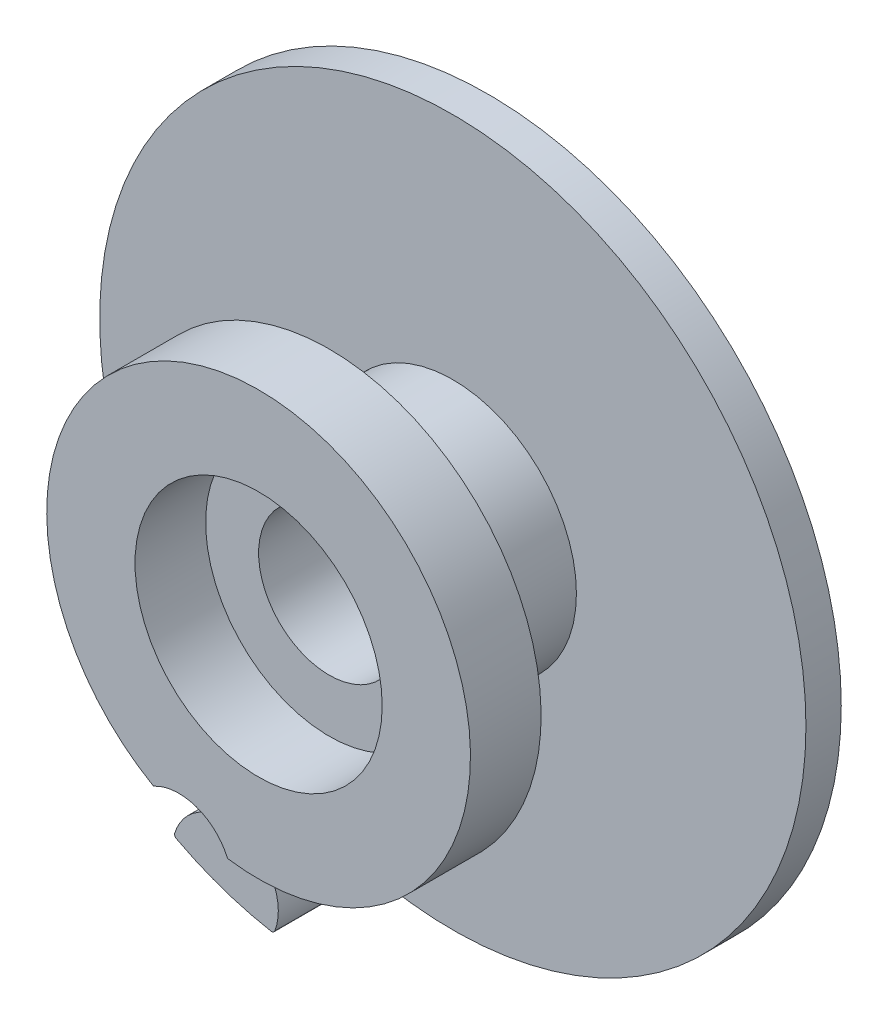
ISO-10303-21;
HEADER;
FILE_DESCRIPTION(('STEP AP214'),'2;1');
FILE_NAME('part.step','',(''),(''),'','','');
FILE_SCHEMA(('AUTOMOTIVE_DESIGN { 1 0 10303 214 1 1 1 1 }'));
ENDSEC;
DATA;
#1=APPLICATION_CONTEXT('core data for automotive mechanical design processes');
#2=APPLICATION_PROTOCOL_DEFINITION('international standard','automotive_design',2000,#1);
#3=PRODUCT_CONTEXT('',#1,'mechanical');
#4=PRODUCT('Part','Part','',(#3));
#5=PRODUCT_RELATED_PRODUCT_CATEGORY('part','',(#4));
#6=PRODUCT_DEFINITION_FORMATION('','',#4);
#7=PRODUCT_DEFINITION_CONTEXT('part definition',#1,'design');
#8=PRODUCT_DEFINITION('design','',#6,#7);
#9=PRODUCT_DEFINITION_SHAPE('','',#8);
#10=(LENGTH_UNIT() NAMED_UNIT(*) SI_UNIT(.MILLI.,.METRE.));
#11=(NAMED_UNIT(*) PLANE_ANGLE_UNIT() SI_UNIT($,.RADIAN.));
#12=(NAMED_UNIT(*) SI_UNIT($,.STERADIAN.) SOLID_ANGLE_UNIT());
#13=UNCERTAINTY_MEASURE_WITH_UNIT(LENGTH_MEASURE(1.E-05),#10,'distance_accuracy_value','');
#14=(GEOMETRIC_REPRESENTATION_CONTEXT(3) GLOBAL_UNCERTAINTY_ASSIGNED_CONTEXT((#13)) GLOBAL_UNIT_ASSIGNED_CONTEXT((#10,
#11,#12)) REPRESENTATION_CONTEXT('',''));
#15=CARTESIAN_POINT('',(0.,0.,0.));
#16=DIRECTION('',(0.,0.,1.));
#17=DIRECTION('',(1.,0.,0.));
#18=AXIS2_PLACEMENT_3D('',#15,#16,#17);
#19=CARTESIAN_POINT('',(-0.45148201026022,11.828968161543,1.3));
#20=DIRECTION('',(0.,0.,-1.));
#21=DIRECTION('',(-1.,0.,0.));
#22=AXIS2_PLACEMENT_3D('',#19,#20,#21);
#23=CYLINDRICAL_SURFACE('',#22,0.3);
#24=CARTESIAN_POINT('',(-0.45148201026022,11.828968161543,0.9));
#25=DIRECTION('',(0.,0.,1.));
#26=DIRECTION('',(1.,0.,0.));
#27=AXIS2_PLACEMENT_3D('',#24,#25,#26);
#28=CIRCLE('',#27,0.3);
#29=CARTESIAN_POINT('',(-0.175768873149546,11.9472147937343,0.9));
#30=VERTEX_POINT('',#29);
#31=CARTESIAN_POINT('',(-0.595215784732207,12.092294199139,0.9));
#32=VERTEX_POINT('',#31);
#33=EDGE_CURVE('E74',#30,#32,#28,.T.);
#34=ORIENTED_EDGE('',*,*,#33,.F.);
#35=DIRECTION('',(0.,0.,-1.));
#36=VECTOR('',#35,1.);
#37=CARTESIAN_POINT('',(-0.175768873149546,11.9472147937343,1.3));
#38=LINE('',#37,#36);
#39=CARTESIAN_POINT('',(-0.175768873149546,11.9472147937343,1.3));
#40=VERTEX_POINT('',#39);
#41=EDGE_CURVE('E12',#40,#30,#38,.T.);
#42=ORIENTED_EDGE('',*,*,#41,.F.);
#43=CARTESIAN_POINT('',(-0.45148201026022,11.828968161543,1.3));
#44=DIRECTION('',(0.,0.,1.));
#45=DIRECTION('',(1.,0.,0.));
#46=AXIS2_PLACEMENT_3D('',#43,#44,#45);
#47=CIRCLE('',#46,0.3);
#48=CARTESIAN_POINT('',(-0.595215784732207,12.092294199139,1.3));
#49=VERTEX_POINT('',#48);
#50=EDGE_CURVE('E75',#40,#49,#47,.T.);
#51=ORIENTED_EDGE('',*,*,#50,.T.);
#52=DIRECTION('',(0.,0.,-1.));
#53=VECTOR('',#52,1.);
#54=CARTESIAN_POINT('',(-0.595215784732207,12.092294199139,1.3));
#55=LINE('',#54,#53);
#56=EDGE_CURVE('E54',#49,#32,#55,.T.);
#57=ORIENTED_EDGE('',*,*,#56,.T.);
#58=EDGE_LOOP('',(#34,#42,#51,#57));
#59=FACE_BOUND('',#58,.T.);
#60=ADVANCED_FACE('F46',(#59),#23,.F.);
#61=CARTESIAN_POINT('',(0.,13.1342722073549,1.3));
#62=DIRECTION('',(0.,0.,-1.));
#63=DIRECTION('',(-1.,0.,0.));
#64=AXIS2_PLACEMENT_3D('',#61,#62,#63);
#65=CYLINDRICAL_SURFACE('',#64,1.2);
#66=CARTESIAN_POINT('',(0.,13.1342722073549,0.9));
#67=DIRECTION('',(0.,0.,1.));
#68=DIRECTION('',(1.,0.,0.));
#69=AXIS2_PLACEMENT_3D('',#66,#67,#68);
#70=CIRCLE('',#69,1.2);
#71=EDGE_CURVE('E77',#30,#32,#70,.T.);
#72=ORIENTED_EDGE('',*,*,#71,.T.);
#73=ORIENTED_EDGE('',*,*,#56,.F.);
#74=CARTESIAN_POINT('',(0.,13.1342722073549,1.3));
#75=DIRECTION('',(0.,0.,1.));
#76=DIRECTION('',(1.,0.,0.));
#77=AXIS2_PLACEMENT_3D('',#74,#75,#76);
#78=CIRCLE('',#77,1.2);
#79=EDGE_CURVE('E61',#40,#49,#78,.T.);
#80=ORIENTED_EDGE('',*,*,#79,.F.);
#81=ORIENTED_EDGE('',*,*,#41,.T.);
#82=EDGE_LOOP('',(#72,#73,#80,#81));
#83=FACE_BOUND('',#82,.T.);
#84=ADVANCED_FACE('F78',(#83),#65,.T.);
#85=CARTESIAN_POINT('',(0.,13.1342722073549,1.3));
#86=DIRECTION('',(0.,0.,-1.));
#87=DIRECTION('',(-1.,0.,0.));
#88=AXIS2_PLACEMENT_3D('',#85,#86,#87);
#89=CYLINDRICAL_SURFACE('',#88,0.7);
#90=CARTESIAN_POINT('',(0.,13.1342722073549,1.3));
#91=DIRECTION('',(0.,0.,1.));
#92=DIRECTION('',(1.,0.,0.));
#93=AXIS2_PLACEMENT_3D('',#90,#91,#92);
#94=CIRCLE('',#93,0.7);
#95=CARTESIAN_POINT('',(0.7,13.1342722073549,1.3));
#96=VERTEX_POINT('',#95);
#97=EDGE_CURVE('E76',#96,#96,#94,.T.);
#98=ORIENTED_EDGE('',*,*,#97,.T.);
#99=EDGE_LOOP('',(#98));
#100=FACE_BOUND('',#99,.T.);
#101=CARTESIAN_POINT('',(0.,13.1342722073549,0.9));
#102=DIRECTION('',(0.,0.,1.));
#103=DIRECTION('',(1.,0.,0.));
#104=AXIS2_PLACEMENT_3D('',#101,#102,#103);
#105=CIRCLE('',#104,0.7);
#106=CARTESIAN_POINT('',(0.7,13.1342722073549,0.9));
#107=VERTEX_POINT('',#106);
#108=EDGE_CURVE('E80',#107,#107,#105,.T.);
#109=ORIENTED_EDGE('',*,*,#108,.F.);
#110=EDGE_LOOP('',(#109));
#111=FACE_BOUND('',#110,.T.);
#112=ADVANCED_FACE('F94',(#100,#111),#89,.F.);
#113=CARTESIAN_POINT('',(0.,0.,1.3));
#114=DIRECTION('',(0.,0.,1.));
#115=DIRECTION('',(1.,0.,0.));
#116=AXIS2_PLACEMENT_3D('',#113,#114,#115);
#117=PLANE('',#116);
#118=ORIENTED_EDGE('',*,*,#50,.F.);
#119=ORIENTED_EDGE('',*,*,#79,.T.);
#120=EDGE_LOOP('',(#118,#119));
#121=FACE_BOUND('',#120,.T.);
#122=ORIENTED_EDGE('',*,*,#97,.F.);
#123=EDGE_LOOP('',(#122));
#124=FACE_BOUND('',#123,.T.);
#125=ADVANCED_FACE('F97',(#121,#124),#117,.T.);
#126=CARTESIAN_POINT('',(0.,0.,0.9));
#127=DIRECTION('',(0.,0.,1.));
#128=DIRECTION('',(1.,0.,0.));
#129=AXIS2_PLACEMENT_3D('',#126,#127,#128);
#130=PLANE('',#129);
#131=ORIENTED_EDGE('',*,*,#33,.T.);
#132=ORIENTED_EDGE('',*,*,#71,.F.);
#133=EDGE_LOOP('',(#131,#132));
#134=FACE_BOUND('',#133,.T.);
#135=ORIENTED_EDGE('',*,*,#108,.T.);
#136=EDGE_LOOP('',(#135));
#137=FACE_BOUND('',#136,.T.);
#138=ADVANCED_FACE('F82',(#134,#137),#130,.F.);
#139=CLOSED_SHELL('',(#60,#84,#112,#125,#138));
#140=MANIFOLD_SOLID_BREP('B2',#139);
#141=CARTESIAN_POINT('',(0.,0.,0.2));
#142=DIRECTION('',(0.,0.,1.));
#143=DIRECTION('',(1.,0.,0.));
#144=AXIS2_PLACEMENT_3D('',#141,#142,#143);
#145=PLANE('',#144);
#146=CARTESIAN_POINT('',(0.,13.1342722073549,0.2));
#147=DIRECTION('',(0.,0.,1.));
#148=DIRECTION('',(1.,0.,0.));
#149=AXIS2_PLACEMENT_3D('',#146,#147,#148);
#150=CIRCLE('',#149,0.7);
#151=CARTESIAN_POINT('',(0.7,13.1342722073549,0.2));
#152=VERTEX_POINT('',#151);
#153=EDGE_CURVE('E218',#152,#152,#150,.F.);
#154=ORIENTED_EDGE('',*,*,#153,.T.);
#155=EDGE_LOOP('',(#154));
#156=FACE_BOUND('',#155,.T.);
#157=CARTESIAN_POINT('',(0.,13.1342722073549,0.2));
#158=DIRECTION('',(0.,0.,1.));
#159=DIRECTION('',(1.,0.,0.));
#160=AXIS2_PLACEMENT_3D('',#157,#158,#159);
#161=CIRCLE('',#160,2.);
#162=CARTESIAN_POINT('',(2.,13.1342722073549,0.2));
#163=VERTEX_POINT('',#162);
#164=EDGE_CURVE('E44',#163,#163,#161,.T.);
#165=ORIENTED_EDGE('',*,*,#164,.T.);
#166=EDGE_LOOP('',(#165));
#167=FACE_BOUND('',#166,.T.);
#168=CARTESIAN_POINT('',(-0.58838701066213,11.4331547141511,0.2));
#169=DIRECTION('',(0.,0.,1.));
#170=DIRECTION('',(1.,0.,0.));
#171=AXIS2_PLACEMENT_3D('',#168,#169,#170);
#172=CIRCLE('',#171,0.3);
#173=CARTESIAN_POINT('',(-0.87474400546622,11.5225955970111,0.2));
#174=VERTEX_POINT('',#173);
#175=CARTESIAN_POINT('',(-0.307964474794942,11.3265563962572,0.2));
#176=VERTEX_POINT('',#175);
#177=EDGE_CURVE('E209',#174,#176,#172,.F.);
#178=ORIENTED_EDGE('',*,*,#177,.T.);
#179=CARTESIAN_POINT('',(-0.326659310519422,11.3336629507834,0.2));
#180=DIRECTION('',(0.,0.,1.));
#181=DIRECTION('',(1.,0.,0.));
#182=AXIS2_PLACEMENT_3D('',#179,#180,#181);
#183=CIRCLE('',#182,0.02);
#184=CARTESIAN_POINT('',(-0.330229357628925,11.3139841610941,0.2));
#185=VERTEX_POINT('',#184);
#186=EDGE_CURVE('E162',#176,#185,#183,.F.);
#187=ORIENTED_EDGE('',*,*,#186,.T.);
#188=CARTESIAN_POINT('',(0.,13.1342722073549,0.2));
#189=DIRECTION('',(0.,0.,1.));
#190=DIRECTION('',(1.,0.,0.));
#191=AXIS2_PLACEMENT_3D('',#188,#189,#190);
#192=CIRCLE('',#191,1.85);
#193=CARTESIAN_POINT('',(-0.865004943945357,11.4989537530623,0.2));
#194=VERTEX_POINT('',#193);
#195=EDGE_CURVE('E200',#185,#194,#192,.F.);
#196=ORIENTED_EDGE('',*,*,#195,.T.);
#197=CARTESIAN_POINT('',(-0.855653539145948,11.5166328714871,0.2));
#198=DIRECTION('',(0.,0.,1.));
#199=DIRECTION('',(1.,0.,0.));
#200=AXIS2_PLACEMENT_3D('',#197,#198,#199);
#201=CIRCLE('',#200,0.0199999999999996);
#202=EDGE_CURVE('E203',#174,#194,#201,.T.);
#203=ORIENTED_EDGE('',*,*,#202,.F.);
#204=EDGE_LOOP('',(#178,#187,#196,#203));
#205=FACE_BOUND('',#204,.T.);
#206=ADVANCED_FACE('F138',(#156,#167,#205),#145,.T.);
#207=CARTESIAN_POINT('',(0.,13.1342722073549,0.2));
#208=DIRECTION('',(0.,0.,-1.));
#209=DIRECTION('',(-1.,0.,0.));
#210=AXIS2_PLACEMENT_3D('',#207,#208,#209);
#211=CYLINDRICAL_SURFACE('',#210,2.);
#212=ORIENTED_EDGE('',*,*,#164,.F.);
#213=EDGE_LOOP('',(#212));
#214=FACE_BOUND('',#213,.T.);
#215=CARTESIAN_POINT('',(0.,13.1342722073549,0.));
#216=DIRECTION('',(0.,0.,1.));
#217=DIRECTION('',(1.,0.,0.));
#218=AXIS2_PLACEMENT_3D('',#215,#216,#217);
#219=CIRCLE('',#218,2.);
#220=CARTESIAN_POINT('',(2.,13.1342722073549,0.));
#221=VERTEX_POINT('',#220);
#222=EDGE_CURVE('E220',#221,#221,#219,.T.);
#223=ORIENTED_EDGE('',*,*,#222,.T.);
#224=EDGE_LOOP('',(#223));
#225=FACE_BOUND('',#224,.T.);
#226=ADVANCED_FACE('F140',(#214,#225),#211,.T.);
#227=CARTESIAN_POINT('',(0.,13.1342722073549,0.2));
#228=DIRECTION('',(0.,0.,-1.));
#229=DIRECTION('',(-1.,0.,0.));
#230=AXIS2_PLACEMENT_3D('',#227,#228,#229);
#231=CYLINDRICAL_SURFACE('',#230,0.4);
#232=CARTESIAN_POINT('',(0.,13.1342722073549,0.));
#233=DIRECTION('',(0.,0.,1.));
#234=DIRECTION('',(1.,0.,0.));
#235=AXIS2_PLACEMENT_3D('',#232,#233,#234);
#236=CIRCLE('',#235,0.4);
#237=CARTESIAN_POINT('',(0.4,13.1342722073549,0.));
#238=VERTEX_POINT('',#237);
#239=EDGE_CURVE('E142',#238,#238,#236,.T.);
#240=ORIENTED_EDGE('',*,*,#239,.F.);
#241=EDGE_LOOP('',(#240));
#242=FACE_BOUND('',#241,.T.);
#243=CARTESIAN_POINT('',(0.,13.1342722073549,0.9));
#244=DIRECTION('',(0.,0.,1.));
#245=DIRECTION('',(1.,0.,0.));
#246=AXIS2_PLACEMENT_3D('',#243,#244,#245);
#247=CIRCLE('',#246,0.4);
#248=CARTESIAN_POINT('',(0.4,13.1342722073549,0.9));
#249=VERTEX_POINT('',#248);
#250=EDGE_CURVE('E212',#249,#249,#247,.T.);
#251=ORIENTED_EDGE('',*,*,#250,.T.);
#252=EDGE_LOOP('',(#251));
#253=FACE_BOUND('',#252,.T.);
#254=ADVANCED_FACE('F229',(#242,#253),#231,.F.);
#255=CARTESIAN_POINT('',(0.,0.,0.));
#256=DIRECTION('',(0.,0.,1.));
#257=DIRECTION('',(1.,0.,0.));
#258=AXIS2_PLACEMENT_3D('',#255,#256,#257);
#259=PLANE('',#258);
#260=ORIENTED_EDGE('',*,*,#222,.F.);
#261=EDGE_LOOP('',(#260));
#262=FACE_BOUND('',#261,.T.);
#263=ORIENTED_EDGE('',*,*,#239,.T.);
#264=EDGE_LOOP('',(#263));
#265=FACE_BOUND('',#264,.T.);
#266=ADVANCED_FACE('F227',(#262,#265),#259,.F.);
#267=CARTESIAN_POINT('',(0.,13.1342722073549,0.9));
#268=DIRECTION('',(0.,0.,-1.));
#269=DIRECTION('',(-1.,0.,0.));
#270=AXIS2_PLACEMENT_3D('',#267,#268,#269);
#271=CYLINDRICAL_SURFACE('',#270,0.7);
#272=ORIENTED_EDGE('',*,*,#153,.F.);
#273=EDGE_LOOP('',(#272));
#274=FACE_BOUND('',#273,.T.);
#275=CARTESIAN_POINT('',(0.,13.1342722073549,0.9));
#276=DIRECTION('',(0.,0.,1.));
#277=DIRECTION('',(1.,0.,0.));
#278=AXIS2_PLACEMENT_3D('',#275,#276,#277);
#279=CIRCLE('',#278,0.7);
#280=CARTESIAN_POINT('',(0.7,13.1342722073549,0.9));
#281=VERTEX_POINT('',#280);
#282=EDGE_CURVE('E215',#281,#281,#279,.T.);
#283=ORIENTED_EDGE('',*,*,#282,.F.);
#284=EDGE_LOOP('',(#283));
#285=FACE_BOUND('',#284,.T.);
#286=ADVANCED_FACE('F237',(#274,#285),#271,.T.);
#287=CARTESIAN_POINT('',(0.,0.,0.9));
#288=DIRECTION('',(0.,0.,1.));
#289=DIRECTION('',(1.,0.,0.));
#290=AXIS2_PLACEMENT_3D('',#287,#288,#289);
#291=PLANE('',#290);
#292=ORIENTED_EDGE('',*,*,#250,.F.);
#293=EDGE_LOOP('',(#292));
#294=FACE_BOUND('',#293,.T.);
#295=ORIENTED_EDGE('',*,*,#282,.T.);
#296=EDGE_LOOP('',(#295));
#297=FACE_BOUND('',#296,.T.);
#298=ADVANCED_FACE('F234',(#294,#297),#291,.T.);
#299=CARTESIAN_POINT('',(-0.326659310519422,11.3336629507834,0.9));
#300=DIRECTION('',(0.,0.,-1.));
#301=DIRECTION('',(-1.,0.,0.));
#302=AXIS2_PLACEMENT_3D('',#299,#300,#301);
#303=CYLINDRICAL_SURFACE('',#302,0.02);
#304=ORIENTED_EDGE('',*,*,#186,.F.);
#305=DIRECTION('',(0.,0.,-1.));
#306=VECTOR('',#305,1.);
#307=CARTESIAN_POINT('',(-0.307964474794942,11.3265563962572,0.9));
#308=LINE('',#307,#306);
#309=CARTESIAN_POINT('',(-0.307964474794942,11.3265563962572,0.9));
#310=VERTEX_POINT('',#309);
#311=EDGE_CURVE('E184',#310,#176,#308,.T.);
#312=ORIENTED_EDGE('',*,*,#311,.F.);
#313=CARTESIAN_POINT('',(-0.326659310519422,11.3336629507834,0.9));
#314=DIRECTION('',(0.,0.,1.));
#315=DIRECTION('',(1.,0.,0.));
#316=AXIS2_PLACEMENT_3D('',#313,#314,#315);
#317=CIRCLE('',#316,0.02);
#318=CARTESIAN_POINT('',(-0.330229357628925,11.3139841610941,0.9));
#319=VERTEX_POINT('',#318);
#320=EDGE_CURVE('E192',#319,#310,#317,.T.);
#321=ORIENTED_EDGE('',*,*,#320,.F.);
#322=DIRECTION('',(0.,0.,-1.));
#323=VECTOR('',#322,1.);
#324=CARTESIAN_POINT('',(-0.330229357628925,11.3139841610941,0.9));
#325=LINE('',#324,#323);
#326=EDGE_CURVE('E264',#319,#185,#325,.T.);
#327=ORIENTED_EDGE('',*,*,#326,.T.);
#328=EDGE_LOOP('',(#304,#312,#321,#327));
#329=FACE_BOUND('',#328,.T.);
#330=ADVANCED_FACE('F199',(#329),#303,.T.);
#331=CARTESIAN_POINT('',(-0.58838701066213,11.4331547141511,0.9));
#332=DIRECTION('',(0.,0.,-1.));
#333=DIRECTION('',(-1.,0.,0.));
#334=AXIS2_PLACEMENT_3D('',#331,#332,#333);
#335=CYLINDRICAL_SURFACE('',#334,0.3);
#336=ORIENTED_EDGE('',*,*,#177,.F.);
#337=DIRECTION('',(0.,0.,-1.));
#338=VECTOR('',#337,1.);
#339=CARTESIAN_POINT('',(-0.87474400546622,11.5225955970111,0.9));
#340=LINE('',#339,#338);
#341=CARTESIAN_POINT('',(-0.87474400546622,11.5225955970111,0.9));
#342=VERTEX_POINT('',#341);
#343=EDGE_CURVE('E187',#342,#174,#340,.T.);
#344=ORIENTED_EDGE('',*,*,#343,.F.);
#345=CARTESIAN_POINT('',(-0.58838701066213,11.4331547141511,0.9));
#346=DIRECTION('',(0.,0.,1.));
#347=DIRECTION('',(1.,0.,0.));
#348=AXIS2_PLACEMENT_3D('',#345,#346,#347);
#349=CIRCLE('',#348,0.3);
#350=EDGE_CURVE('E181',#310,#342,#349,.T.);
#351=ORIENTED_EDGE('',*,*,#350,.F.);
#352=ORIENTED_EDGE('',*,*,#311,.T.);
#353=EDGE_LOOP('',(#336,#344,#351,#352));
#354=FACE_BOUND('',#353,.T.);
#355=ADVANCED_FACE('F183',(#354),#335,.T.);
#356=CARTESIAN_POINT('',(-0.855653539145948,11.5166328714871,0.9));
#357=DIRECTION('',(0.,0.,-1.));
#358=DIRECTION('',(-1.,0.,0.));
#359=AXIS2_PLACEMENT_3D('',#356,#357,#358);
#360=CYLINDRICAL_SURFACE('',#359,0.0199999999999996);
#361=ORIENTED_EDGE('',*,*,#343,.T.);
#362=ORIENTED_EDGE('',*,*,#202,.T.);
#363=DIRECTION('',(0.,0.,-1.));
#364=VECTOR('',#363,1.);
#365=CARTESIAN_POINT('',(-0.865004943945357,11.4989537530623,0.9));
#366=LINE('',#365,#364);
#367=CARTESIAN_POINT('',(-0.865004943945357,11.4989537530623,0.9));
#368=VERTEX_POINT('',#367);
#369=EDGE_CURVE('E154',#368,#194,#366,.T.);
#370=ORIENTED_EDGE('',*,*,#369,.F.);
#371=CARTESIAN_POINT('',(-0.855653539145948,11.5166328714871,0.9));
#372=DIRECTION('',(0.,0.,1.));
#373=DIRECTION('',(1.,0.,0.));
#374=AXIS2_PLACEMENT_3D('',#371,#372,#373);
#375=CIRCLE('',#374,0.0199999999999996);
#376=EDGE_CURVE('E191',#368,#342,#375,.F.);
#377=ORIENTED_EDGE('',*,*,#376,.T.);
#378=EDGE_LOOP('',(#361,#362,#370,#377));
#379=FACE_BOUND('',#378,.T.);
#380=ADVANCED_FACE('F262',(#379),#360,.T.);
#381=CARTESIAN_POINT('',(0.,13.1342722073549,0.9));
#382=DIRECTION('',(0.,0.,-1.));
#383=DIRECTION('',(-1.,0.,0.));
#384=AXIS2_PLACEMENT_3D('',#381,#382,#383);
#385=CYLINDRICAL_SURFACE('',#384,1.85);
#386=ORIENTED_EDGE('',*,*,#195,.F.);
#387=ORIENTED_EDGE('',*,*,#326,.F.);
#388=CARTESIAN_POINT('',(0.,13.1342722073549,0.9));
#389=DIRECTION('',(0.,0.,1.));
#390=DIRECTION('',(1.,0.,0.));
#391=AXIS2_PLACEMENT_3D('',#388,#389,#390);
#392=CIRCLE('',#391,1.85);
#393=EDGE_CURVE('E196',#368,#319,#392,.T.);
#394=ORIENTED_EDGE('',*,*,#393,.F.);
#395=ORIENTED_EDGE('',*,*,#369,.T.);
#396=EDGE_LOOP('',(#386,#387,#394,#395));
#397=FACE_BOUND('',#396,.T.);
#398=ADVANCED_FACE('F267',(#397),#385,.T.);
#399=CARTESIAN_POINT('',(0.,0.,0.9));
#400=DIRECTION('',(0.,0.,1.));
#401=DIRECTION('',(1.,0.,0.));
#402=AXIS2_PLACEMENT_3D('',#399,#400,#401);
#403=PLANE('',#402);
#404=ORIENTED_EDGE('',*,*,#320,.T.);
#405=ORIENTED_EDGE('',*,*,#350,.T.);
#406=ORIENTED_EDGE('',*,*,#376,.F.);
#407=ORIENTED_EDGE('',*,*,#393,.T.);
#408=EDGE_LOOP('',(#404,#405,#406,#407));
#409=FACE_BOUND('',#408,.T.);
#410=ADVANCED_FACE('F195',(#409),#403,.T.);
#411=CLOSED_SHELL('',(#206,#226,#254,#266,#286,#298,#330,#355,#380,#398,#410));
#412=MANIFOLD_SOLID_BREP('B6',#411);
#413=ADVANCED_BREP_SHAPE_REPRESENTATION('',(#18,#140,#412),#14);
#414=SHAPE_DEFINITION_REPRESENTATION(#9,#413);
ENDSEC;
END-ISO-10303-21;
